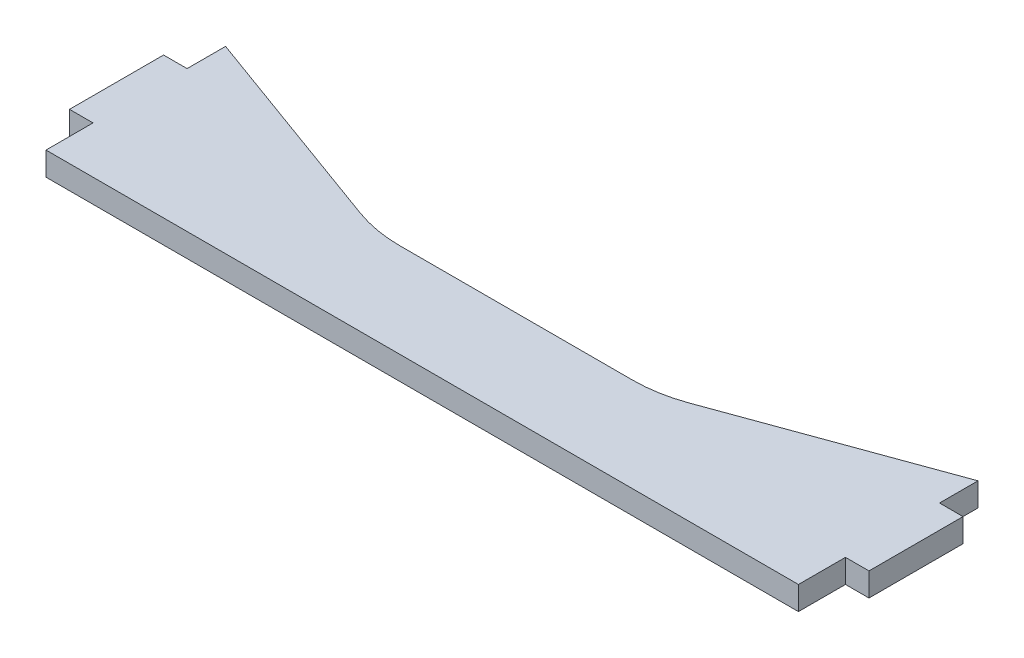
ISO-10303-21;
HEADER;
FILE_DESCRIPTION(('STEP AP214'),'2;1');
FILE_NAME('part.step','',(''),(''),'','','');
FILE_SCHEMA(('AUTOMOTIVE_DESIGN { 1 0 10303 214 1 1 1 1 }'));
ENDSEC;
DATA;
#1=APPLICATION_CONTEXT('core data for automotive mechanical design processes');
#2=APPLICATION_PROTOCOL_DEFINITION('international standard','automotive_design',2000,#1);
#3=PRODUCT_CONTEXT('',#1,'mechanical');
#4=PRODUCT('Part','Part','',(#3));
#5=PRODUCT_RELATED_PRODUCT_CATEGORY('part','',(#4));
#6=PRODUCT_DEFINITION_FORMATION('','',#4);
#7=PRODUCT_DEFINITION_CONTEXT('part definition',#1,'design');
#8=PRODUCT_DEFINITION('design','',#6,#7);
#9=PRODUCT_DEFINITION_SHAPE('','',#8);
#10=(LENGTH_UNIT() NAMED_UNIT(*) SI_UNIT(.MILLI.,.METRE.));
#11=(NAMED_UNIT(*) PLANE_ANGLE_UNIT() SI_UNIT($,.RADIAN.));
#12=(NAMED_UNIT(*) SI_UNIT($,.STERADIAN.) SOLID_ANGLE_UNIT());
#13=UNCERTAINTY_MEASURE_WITH_UNIT(LENGTH_MEASURE(1.E-05),#10,'distance_accuracy_value','');
#14=(GEOMETRIC_REPRESENTATION_CONTEXT(3) GLOBAL_UNCERTAINTY_ASSIGNED_CONTEXT((#13)) GLOBAL_UNIT_ASSIGNED_CONTEXT((#10,
#11,#12)) REPRESENTATION_CONTEXT('',''));
#15=CARTESIAN_POINT('',(0.,0.,0.));
#16=DIRECTION('',(0.,0.,1.));
#17=DIRECTION('',(1.,0.,0.));
#18=AXIS2_PLACEMENT_3D('',#15,#16,#17);
#19=CARTESIAN_POINT('',(0.,5.,0.));
#20=DIRECTION('',(1.,0.,0.));
#21=DIRECTION('',(0.,0.,-1.));
#22=AXIS2_PLACEMENT_3D('',#19,#20,#21);
#23=PLANE('',#22);
#24=DIRECTION('',(0.,0.,1.));
#25=VECTOR('',#24,1.);
#26=CARTESIAN_POINT('',(0.,0.,0.));
#27=LINE('',#26,#25);
#28=CARTESIAN_POINT('',(0.,0.,-30.));
#29=VERTEX_POINT('',#28);
#30=CARTESIAN_POINT('',(0.,0.,-10.));
#31=VERTEX_POINT('',#30);
#32=EDGE_CURVE('E174',#29,#31,#27,.T.);
#33=ORIENTED_EDGE('',*,*,#32,.T.);
#34=DIRECTION('',(0.,-1.,0.));
#35=VECTOR('',#34,1.);
#36=CARTESIAN_POINT('',(0.,10.,-10.));
#37=LINE('',#36,#35);
#38=CARTESIAN_POINT('',(0.,5.,-10.));
#39=VERTEX_POINT('',#38);
#40=EDGE_CURVE('E52',#39,#31,#37,.T.);
#41=ORIENTED_EDGE('',*,*,#40,.F.);
#42=DIRECTION('',(0.,0.,1.));
#43=VECTOR('',#42,1.);
#44=CARTESIAN_POINT('',(0.,5.,0.));
#45=LINE('',#44,#43);
#46=CARTESIAN_POINT('',(0.,5.,-30.));
#47=VERTEX_POINT('',#46);
#48=EDGE_CURVE('E192',#47,#39,#45,.T.);
#49=ORIENTED_EDGE('',*,*,#48,.F.);
#50=DIRECTION('',(0.,-1.,0.));
#51=VECTOR('',#50,1.);
#52=CARTESIAN_POINT('',(0.,10.,-30.));
#53=LINE('',#52,#51);
#54=EDGE_CURVE('E287',#47,#29,#53,.T.);
#55=ORIENTED_EDGE('',*,*,#54,.T.);
#56=EDGE_LOOP('',(#33,#41,#49,#55));
#57=FACE_BOUND('',#56,.T.);
#58=ADVANCED_FACE('F37',(#57),#23,.F.);
#59=CARTESIAN_POINT('',(0.,5.,0.));
#60=DIRECTION('',(0.,0.,-1.));
#61=DIRECTION('',(-1.,0.,0.));
#62=AXIS2_PLACEMENT_3D('',#59,#60,#61);
#63=PLANE('',#62);
#64=DIRECTION('',(1.,0.,0.));
#65=VECTOR('',#64,1.);
#66=CARTESIAN_POINT('',(0.,5.,0.));
#67=LINE('',#66,#65);
#68=CARTESIAN_POINT('',(4.99999999999999,5.,0.));
#69=VERTEX_POINT('',#68);
#70=CARTESIAN_POINT('',(165.,5.,0.));
#71=VERTEX_POINT('',#70);
#72=EDGE_CURVE('E167',#69,#71,#67,.T.);
#73=ORIENTED_EDGE('',*,*,#72,.F.);
#74=DIRECTION('',(0.,-1.,0.));
#75=VECTOR('',#74,1.);
#76=CARTESIAN_POINT('',(4.99999999999999,10.,0.));
#77=LINE('',#76,#75);
#78=CARTESIAN_POINT('',(4.99999999999999,0.,0.));
#79=VERTEX_POINT('',#78);
#80=EDGE_CURVE('E153',#69,#79,#77,.T.);
#81=ORIENTED_EDGE('',*,*,#80,.T.);
#82=DIRECTION('',(1.,0.,0.));
#83=VECTOR('',#82,1.);
#84=CARTESIAN_POINT('',(0.,0.,0.));
#85=LINE('',#84,#83);
#86=CARTESIAN_POINT('',(165.,0.,0.));
#87=VERTEX_POINT('',#86);
#88=EDGE_CURVE('E165',#79,#87,#85,.T.);
#89=ORIENTED_EDGE('',*,*,#88,.T.);
#90=DIRECTION('',(0.,-1.,0.));
#91=VECTOR('',#90,1.);
#92=CARTESIAN_POINT('',(165.,10.,0.));
#93=LINE('',#92,#91);
#94=EDGE_CURVE('E307',#71,#87,#93,.T.);
#95=ORIENTED_EDGE('',*,*,#94,.F.);
#96=EDGE_LOOP('',(#73,#81,#89,#95));
#97=FACE_BOUND('',#96,.T.);
#98=ADVANCED_FACE('F163',(#97),#63,.F.);
#99=CARTESIAN_POINT('',(170.,5.,0.));
#100=DIRECTION('',(-1.,0.,0.));
#101=DIRECTION('',(0.,0.,1.));
#102=AXIS2_PLACEMENT_3D('',#99,#100,#101);
#103=PLANE('',#102);
#104=DIRECTION('',(0.,0.,-1.));
#105=VECTOR('',#104,1.);
#106=CARTESIAN_POINT('',(170.,0.,0.));
#107=LINE('',#106,#105);
#108=CARTESIAN_POINT('',(170.,0.,-9.99999999999999));
#109=VERTEX_POINT('',#108);
#110=CARTESIAN_POINT('',(170.,0.,-30.));
#111=VERTEX_POINT('',#110);
#112=EDGE_CURVE('E173',#109,#111,#107,.T.);
#113=ORIENTED_EDGE('',*,*,#112,.T.);
#114=DIRECTION('',(0.,-1.,0.));
#115=VECTOR('',#114,1.);
#116=CARTESIAN_POINT('',(170.,10.,-30.));
#117=LINE('',#116,#115);
#118=CARTESIAN_POINT('',(170.,5.,-30.));
#119=VERTEX_POINT('',#118);
#120=EDGE_CURVE('E299',#119,#111,#117,.T.);
#121=ORIENTED_EDGE('',*,*,#120,.F.);
#122=DIRECTION('',(0.,0.,-1.));
#123=VECTOR('',#122,1.);
#124=CARTESIAN_POINT('',(170.,5.,0.));
#125=LINE('',#124,#123);
#126=CARTESIAN_POINT('',(170.,5.,-9.99999999999999));
#127=VERTEX_POINT('',#126);
#128=EDGE_CURVE('E252',#127,#119,#125,.T.);
#129=ORIENTED_EDGE('',*,*,#128,.F.);
#130=DIRECTION('',(0.,-1.,0.));
#131=VECTOR('',#130,1.);
#132=CARTESIAN_POINT('',(170.,10.,-9.99999999999999));
#133=LINE('',#132,#131);
#134=EDGE_CURVE('E309',#127,#109,#133,.T.);
#135=ORIENTED_EDGE('',*,*,#134,.T.);
#136=EDGE_LOOP('',(#113,#121,#129,#135));
#137=FACE_BOUND('',#136,.T.);
#138=ADVANCED_FACE('F319',(#137),#103,.F.);
#139=CARTESIAN_POINT('',(0.,5.,-20.));
#140=DIRECTION('',(0.,0.,1.));
#141=DIRECTION('',(1.,0.,0.));
#142=AXIS2_PLACEMENT_3D('',#139,#140,#141);
#143=PLANE('',#142);
#144=DIRECTION('',(-1.,0.,0.));
#145=VECTOR('',#144,1.);
#146=CARTESIAN_POINT('',(0.,0.,-20.));
#147=LINE('',#146,#145);
#148=CARTESIAN_POINT('',(109.714750669603,0.,-20.));
#149=VERTEX_POINT('',#148);
#150=CARTESIAN_POINT('',(60.2852493303972,0.,-20.));
#151=VERTEX_POINT('',#150);
#152=EDGE_CURVE('E177',#149,#151,#147,.T.);
#153=ORIENTED_EDGE('',*,*,#152,.T.);
#154=DIRECTION('',(0.,1.,0.));
#155=VECTOR('',#154,1.);
#156=CARTESIAN_POINT('',(60.2852493303972,5.,-20.));
#157=LINE('',#156,#155);
#158=CARTESIAN_POINT('',(60.2852493303972,5.,-20.));
#159=VERTEX_POINT('',#158);
#160=EDGE_CURVE('E196',#151,#159,#157,.T.);
#161=ORIENTED_EDGE('',*,*,#160,.T.);
#162=DIRECTION('',(-1.,0.,0.));
#163=VECTOR('',#162,1.);
#164=CARTESIAN_POINT('',(0.,5.,-20.));
#165=LINE('',#164,#163);
#166=CARTESIAN_POINT('',(109.714750669603,5.,-20.));
#167=VERTEX_POINT('',#166);
#168=EDGE_CURVE('E193',#167,#159,#165,.T.);
#169=ORIENTED_EDGE('',*,*,#168,.F.);
#170=DIRECTION('',(0.,1.,0.));
#171=VECTOR('',#170,1.);
#172=CARTESIAN_POINT('',(109.714750669603,5.,-20.));
#173=LINE('',#172,#171);
#174=EDGE_CURVE('E194',#167,#149,#173,.F.);
#175=ORIENTED_EDGE('',*,*,#174,.T.);
#176=EDGE_LOOP('',(#153,#161,#169,#175));
#177=FACE_BOUND('',#176,.T.);
#178=ADVANCED_FACE('F261',(#177),#143,.F.);
#179=CARTESIAN_POINT('',(0.,5.,0.));
#180=DIRECTION('',(0.,-1.,0.));
#181=DIRECTION('',(0.,0.,-1.));
#182=AXIS2_PLACEMENT_3D('',#179,#180,#181);
#183=PLANE('',#182);
#184=DIRECTION('',(1.,0.,0.));
#185=VECTOR('',#184,1.);
#186=CARTESIAN_POINT('',(0.,5.,-10.));
#187=LINE('',#186,#185);
#188=CARTESIAN_POINT('',(4.99999999999999,5.,-10.));
#189=VERTEX_POINT('',#188);
#190=EDGE_CURVE('E283',#39,#189,#187,.T.);
#191=ORIENTED_EDGE('',*,*,#190,.T.);
#192=DIRECTION('',(0.,0.,1.));
#193=VECTOR('',#192,1.);
#194=CARTESIAN_POINT('',(4.99999999999999,5.,0.));
#195=LINE('',#194,#193);
#196=EDGE_CURVE('E279',#189,#69,#195,.T.);
#197=ORIENTED_EDGE('',*,*,#196,.T.);
#198=ORIENTED_EDGE('',*,*,#72,.T.);
#199=DIRECTION('',(0.,0.,-1.));
#200=VECTOR('',#199,1.);
#201=CARTESIAN_POINT('',(165.,5.,0.));
#202=LINE('',#201,#200);
#203=CARTESIAN_POINT('',(165.,5.,-9.99999999999999));
#204=VERTEX_POINT('',#203);
#205=EDGE_CURVE('E242',#71,#204,#202,.T.);
#206=ORIENTED_EDGE('',*,*,#205,.T.);
#207=DIRECTION('',(1.,0.,0.));
#208=VECTOR('',#207,1.);
#209=CARTESIAN_POINT('',(0.,5.,-9.99999999999999));
#210=LINE('',#209,#208);
#211=EDGE_CURVE('E246',#204,#127,#210,.T.);
#212=ORIENTED_EDGE('',*,*,#211,.T.);
#213=ORIENTED_EDGE('',*,*,#128,.T.);
#214=DIRECTION('',(-1.,0.,0.));
#215=VECTOR('',#214,1.);
#216=CARTESIAN_POINT('',(0.,5.,-30.));
#217=LINE('',#216,#215);
#218=CARTESIAN_POINT('',(165.,5.,-30.));
#219=VERTEX_POINT('',#218);
#220=EDGE_CURVE('E237',#119,#219,#217,.T.);
#221=ORIENTED_EDGE('',*,*,#220,.T.);
#222=DIRECTION('',(0.,0.,-1.));
#223=VECTOR('',#222,1.);
#224=CARTESIAN_POINT('',(165.,5.,0.));
#225=LINE('',#224,#223);
#226=CARTESIAN_POINT('',(165.,5.,-38.1818181818182));
#227=VERTEX_POINT('',#226);
#228=EDGE_CURVE('E223',#219,#227,#225,.T.);
#229=ORIENTED_EDGE('',*,*,#228,.T.);
#230=DIRECTION('',(-0.939793423488437,0.,0.341743063086704));
#231=VECTOR('',#230,1.);
#232=CARTESIAN_POINT('',(7.007299270073,5.,19.2700729927007));
#233=LINE('',#232,#231);
#234=CARTESIAN_POINT('',(119.967042562204,5.,-21.8061972953469));
#235=VERTEX_POINT('',#234);
#236=EDGE_CURVE('E234',#227,#235,#233,.T.);
#237=ORIENTED_EDGE('',*,*,#236,.T.);
#238=CARTESIAN_POINT('',(109.714750669603,5.,-50.));
#239=DIRECTION('',(0.,-1.,0.));
#240=DIRECTION('',(0.,0.,-1.));
#241=AXIS2_PLACEMENT_3D('',#238,#239,#240);
#242=CIRCLE('',#241,30.);
#243=EDGE_CURVE('E215',#235,#167,#242,.T.);
#244=ORIENTED_EDGE('',*,*,#243,.T.);
#245=ORIENTED_EDGE('',*,*,#168,.T.);
#246=CARTESIAN_POINT('',(60.2852493303972,5.,-50.));
#247=DIRECTION('',(0.,-1.,0.));
#248=DIRECTION('',(0.,0.,-1.));
#249=AXIS2_PLACEMENT_3D('',#246,#247,#248);
#250=CIRCLE('',#249,30.);
#251=CARTESIAN_POINT('',(50.032957437796,5.,-21.8061972953469));
#252=VERTEX_POINT('',#251);
#253=EDGE_CURVE('E211',#159,#252,#250,.T.);
#254=ORIENTED_EDGE('',*,*,#253,.T.);
#255=DIRECTION('',(-0.939793423488437,0.,-0.341743063086704));
#256=VECTOR('',#255,1.);
#257=CARTESIAN_POINT('',(12.8467153284672,5.,-35.3284671532847));
#258=LINE('',#257,#256);
#259=CARTESIAN_POINT('',(4.99999999999999,5.,-38.1818181818182));
#260=VERTEX_POINT('',#259);
#261=EDGE_CURVE('E200',#252,#260,#258,.T.);
#262=ORIENTED_EDGE('',*,*,#261,.T.);
#263=DIRECTION('',(0.,0.,1.));
#264=VECTOR('',#263,1.);
#265=CARTESIAN_POINT('',(4.99999999999999,5.,0.));
#266=LINE('',#265,#264);
#267=CARTESIAN_POINT('',(4.99999999999999,5.,-30.));
#268=VERTEX_POINT('',#267);
#269=EDGE_CURVE('E59',#260,#268,#266,.T.);
#270=ORIENTED_EDGE('',*,*,#269,.T.);
#271=DIRECTION('',(-1.,0.,0.));
#272=VECTOR('',#271,1.);
#273=CARTESIAN_POINT('',(0.,5.,-30.));
#274=LINE('',#273,#272);
#275=EDGE_CURVE('E292',#268,#47,#274,.T.);
#276=ORIENTED_EDGE('',*,*,#275,.T.);
#277=ORIENTED_EDGE('',*,*,#48,.T.);
#278=EDGE_LOOP('',(#191,#197,#198,#206,#212,#213,#221,#229,#237,#244,#245,#254,#262,#270,#276,#277));
#279=FACE_BOUND('',#278,.T.);
#280=ADVANCED_FACE('F233',(#279),#183,.F.);
#281=CARTESIAN_POINT('',(0.,0.,0.));
#282=DIRECTION('',(0.,-1.,0.));
#283=DIRECTION('',(0.,0.,-1.));
#284=AXIS2_PLACEMENT_3D('',#281,#282,#283);
#285=PLANE('',#284);
#286=DIRECTION('',(0.,0.,1.));
#287=VECTOR('',#286,1.);
#288=CARTESIAN_POINT('',(4.99999999999999,0.,-10.));
#289=LINE('',#288,#287);
#290=CARTESIAN_POINT('',(4.99999999999999,0.,-10.));
#291=VERTEX_POINT('',#290);
#292=EDGE_CURVE('E150',#291,#79,#289,.T.);
#293=ORIENTED_EDGE('',*,*,#292,.F.);
#294=DIRECTION('',(1.,0.,0.));
#295=VECTOR('',#294,1.);
#296=CARTESIAN_POINT('',(4.99999999999999,0.,-10.));
#297=LINE('',#296,#295);
#298=EDGE_CURVE('E159',#31,#291,#297,.T.);
#299=ORIENTED_EDGE('',*,*,#298,.F.);
#300=ORIENTED_EDGE('',*,*,#32,.F.);
#301=DIRECTION('',(-1.,0.,0.));
#302=VECTOR('',#301,1.);
#303=CARTESIAN_POINT('',(4.99999999999999,0.,-30.));
#304=LINE('',#303,#302);
#305=CARTESIAN_POINT('',(4.99999999999999,0.,-30.));
#306=VERTEX_POINT('',#305);
#307=EDGE_CURVE('E278',#306,#29,#304,.T.);
#308=ORIENTED_EDGE('',*,*,#307,.F.);
#309=DIRECTION('',(0.,0.,1.));
#310=VECTOR('',#309,1.);
#311=CARTESIAN_POINT('',(4.99999999999999,0.,-30.));
#312=LINE('',#311,#310);
#313=CARTESIAN_POINT('',(4.99999999999999,0.,-38.1818181818182));
#314=VERTEX_POINT('',#313);
#315=EDGE_CURVE('E276',#314,#306,#312,.T.);
#316=ORIENTED_EDGE('',*,*,#315,.F.);
#317=DIRECTION('',(-0.939793423488437,0.,-0.341743063086704));
#318=VECTOR('',#317,1.);
#319=CARTESIAN_POINT('',(12.8467153284672,0.,-35.3284671532847));
#320=LINE('',#319,#318);
#321=CARTESIAN_POINT('',(50.032957437796,0.,-21.8061972953469));
#322=VERTEX_POINT('',#321);
#323=EDGE_CURVE('E180',#322,#314,#320,.T.);
#324=ORIENTED_EDGE('',*,*,#323,.F.);
#325=CARTESIAN_POINT('',(60.2852493303972,0.,-50.));
#326=DIRECTION('',(0.,-1.,0.));
#327=DIRECTION('',(0.,0.,-1.));
#328=AXIS2_PLACEMENT_3D('',#325,#326,#327);
#329=CIRCLE('',#328,30.);
#330=EDGE_CURVE('E213',#322,#151,#329,.F.);
#331=ORIENTED_EDGE('',*,*,#330,.T.);
#332=ORIENTED_EDGE('',*,*,#152,.F.);
#333=CARTESIAN_POINT('',(109.714750669603,0.,-50.));
#334=DIRECTION('',(0.,-1.,0.));
#335=DIRECTION('',(0.,0.,-1.));
#336=AXIS2_PLACEMENT_3D('',#333,#334,#335);
#337=CIRCLE('',#336,30.);
#338=CARTESIAN_POINT('',(119.967042562204,0.,-21.8061972953469));
#339=VERTEX_POINT('',#338);
#340=EDGE_CURVE('E217',#149,#339,#337,.F.);
#341=ORIENTED_EDGE('',*,*,#340,.T.);
#342=DIRECTION('',(-0.939793423488437,0.,0.341743063086704));
#343=VECTOR('',#342,1.);
#344=CARTESIAN_POINT('',(7.007299270073,0.,19.2700729927007));
#345=LINE('',#344,#343);
#346=CARTESIAN_POINT('',(165.,0.,-38.1818181818182));
#347=VERTEX_POINT('',#346);
#348=EDGE_CURVE('E203',#347,#339,#345,.T.);
#349=ORIENTED_EDGE('',*,*,#348,.F.);
#350=DIRECTION('',(0.,0.,-1.));
#351=VECTOR('',#350,1.);
#352=CARTESIAN_POINT('',(165.,0.,-30.));
#353=LINE('',#352,#351);
#354=CARTESIAN_POINT('',(165.,0.,-30.));
#355=VERTEX_POINT('',#354);
#356=EDGE_CURVE('E226',#355,#347,#353,.T.);
#357=ORIENTED_EDGE('',*,*,#356,.F.);
#358=DIRECTION('',(-1.,0.,0.));
#359=VECTOR('',#358,1.);
#360=CARTESIAN_POINT('',(165.,0.,-30.));
#361=LINE('',#360,#359);
#362=EDGE_CURVE('E296',#111,#355,#361,.T.);
#363=ORIENTED_EDGE('',*,*,#362,.F.);
#364=ORIENTED_EDGE('',*,*,#112,.F.);
#365=DIRECTION('',(1.,0.,0.));
#366=VECTOR('',#365,1.);
#367=CARTESIAN_POINT('',(165.,0.,-9.99999999999999));
#368=LINE('',#367,#366);
#369=CARTESIAN_POINT('',(165.,0.,-9.99999999999999));
#370=VERTEX_POINT('',#369);
#371=EDGE_CURVE('E304',#370,#109,#368,.T.);
#372=ORIENTED_EDGE('',*,*,#371,.F.);
#373=DIRECTION('',(0.,0.,-1.));
#374=VECTOR('',#373,1.);
#375=CARTESIAN_POINT('',(165.,0.,-9.99999999999999));
#376=LINE('',#375,#374);
#377=EDGE_CURVE('E172',#87,#370,#376,.T.);
#378=ORIENTED_EDGE('',*,*,#377,.F.);
#379=ORIENTED_EDGE('',*,*,#88,.F.);
#380=EDGE_LOOP('',(#293,#299,#300,#308,#316,#324,#331,#332,#341,#349,#357,#363,#364,#372,#378,#379));
#381=FACE_BOUND('',#380,.T.);
#382=ADVANCED_FACE('F170',(#381),#285,.T.);
#383=CARTESIAN_POINT('',(12.8467153284672,0.,-35.3284671532847));
#384=DIRECTION('',(0.341743063086704,0.,-0.939793423488437));
#385=DIRECTION('',(-0.939793423488437,0.,-0.341743063086704));
#386=AXIS2_PLACEMENT_3D('',#383,#384,#385);
#387=PLANE('',#386);
#388=DIRECTION('',(0.,-1.,0.));
#389=VECTOR('',#388,1.);
#390=CARTESIAN_POINT('',(4.99999999999999,0.,-38.1818181818182));
#391=LINE('',#390,#389);
#392=EDGE_CURVE('E12',#260,#314,#391,.T.);
#393=ORIENTED_EDGE('',*,*,#392,.F.);
#394=ORIENTED_EDGE('',*,*,#261,.F.);
#395=DIRECTION('',(0.,1.,0.));
#396=VECTOR('',#395,1.);
#397=CARTESIAN_POINT('',(50.032957437796,0.,-21.8061972953469));
#398=LINE('',#397,#396);
#399=EDGE_CURVE('E199',#252,#322,#398,.F.);
#400=ORIENTED_EDGE('',*,*,#399,.T.);
#401=ORIENTED_EDGE('',*,*,#323,.T.);
#402=EDGE_LOOP('',(#393,#394,#400,#401));
#403=FACE_BOUND('',#402,.T.);
#404=ADVANCED_FACE('F272',(#403),#387,.T.);
#405=CARTESIAN_POINT('',(7.007299270073,0.,19.2700729927007));
#406=DIRECTION('',(-0.341743063086704,0.,-0.939793423488437));
#407=DIRECTION('',(-0.939793423488437,0.,0.341743063086704));
#408=AXIS2_PLACEMENT_3D('',#405,#406,#407);
#409=PLANE('',#408);
#410=DIRECTION('',(0.,1.,0.));
#411=VECTOR('',#410,1.);
#412=CARTESIAN_POINT('',(165.,0.,-38.1818181818182));
#413=LINE('',#412,#411);
#414=EDGE_CURVE('E45',#347,#227,#413,.T.);
#415=ORIENTED_EDGE('',*,*,#414,.F.);
#416=ORIENTED_EDGE('',*,*,#348,.T.);
#417=DIRECTION('',(0.,1.,0.));
#418=VECTOR('',#417,1.);
#419=CARTESIAN_POINT('',(119.967042562204,0.,-21.8061972953469));
#420=LINE('',#419,#418);
#421=EDGE_CURVE('E208',#339,#235,#420,.T.);
#422=ORIENTED_EDGE('',*,*,#421,.T.);
#423=ORIENTED_EDGE('',*,*,#236,.F.);
#424=EDGE_LOOP('',(#415,#416,#422,#423));
#425=FACE_BOUND('',#424,.T.);
#426=ADVANCED_FACE('F240',(#425),#409,.T.);
#427=CARTESIAN_POINT('',(60.2852493303972,5.,-50.));
#428=DIRECTION('',(0.,1.,0.));
#429=DIRECTION('',(0.,0.,1.));
#430=AXIS2_PLACEMENT_3D('',#427,#428,#429);
#431=CYLINDRICAL_SURFACE('',#430,30.);
#432=ORIENTED_EDGE('',*,*,#330,.F.);
#433=ORIENTED_EDGE('',*,*,#399,.F.);
#434=ORIENTED_EDGE('',*,*,#253,.F.);
#435=ORIENTED_EDGE('',*,*,#160,.F.);
#436=EDGE_LOOP('',(#432,#433,#434,#435));
#437=FACE_BOUND('',#436,.T.);
#438=ADVANCED_FACE('F269',(#437),#431,.F.);
#439=CARTESIAN_POINT('',(109.714750669603,0.,-50.));
#440=DIRECTION('',(0.,1.,0.));
#441=DIRECTION('',(0.,0.,1.));
#442=AXIS2_PLACEMENT_3D('',#439,#440,#441);
#443=CYLINDRICAL_SURFACE('',#442,30.);
#444=ORIENTED_EDGE('',*,*,#340,.F.);
#445=ORIENTED_EDGE('',*,*,#174,.F.);
#446=ORIENTED_EDGE('',*,*,#243,.F.);
#447=ORIENTED_EDGE('',*,*,#421,.F.);
#448=EDGE_LOOP('',(#444,#445,#446,#447));
#449=FACE_BOUND('',#448,.T.);
#450=ADVANCED_FACE('F39',(#449),#443,.F.);
#451=CARTESIAN_POINT('',(165.,10.,-9.99999999999999));
#452=DIRECTION('',(-1.,0.,0.));
#453=DIRECTION('',(0.,0.,1.));
#454=AXIS2_PLACEMENT_3D('',#451,#452,#453);
#455=PLANE('',#454);
#456=ORIENTED_EDGE('',*,*,#94,.T.);
#457=ORIENTED_EDGE('',*,*,#377,.T.);
#458=DIRECTION('',(0.,-1.,0.));
#459=VECTOR('',#458,1.);
#460=CARTESIAN_POINT('',(165.,10.,-9.99999999999999));
#461=LINE('',#460,#459);
#462=EDGE_CURVE('E306',#204,#370,#461,.T.);
#463=ORIENTED_EDGE('',*,*,#462,.F.);
#464=ORIENTED_EDGE('',*,*,#205,.F.);
#465=EDGE_LOOP('',(#456,#457,#463,#464));
#466=FACE_BOUND('',#465,.T.);
#467=ADVANCED_FACE('F326',(#466),#455,.F.);
#468=CARTESIAN_POINT('',(165.,10.,-9.99999999999999));
#469=DIRECTION('',(0.,0.,-1.));
#470=DIRECTION('',(-1.,0.,0.));
#471=AXIS2_PLACEMENT_3D('',#468,#469,#470);
#472=PLANE('',#471);
#473=ORIENTED_EDGE('',*,*,#462,.T.);
#474=ORIENTED_EDGE('',*,*,#371,.T.);
#475=ORIENTED_EDGE('',*,*,#134,.F.);
#476=ORIENTED_EDGE('',*,*,#211,.F.);
#477=EDGE_LOOP('',(#473,#474,#475,#476));
#478=FACE_BOUND('',#477,.T.);
#479=ADVANCED_FACE('F324',(#478),#472,.F.);
#480=CARTESIAN_POINT('',(165.,10.,-30.));
#481=DIRECTION('',(0.,0.,1.));
#482=DIRECTION('',(1.,0.,0.));
#483=AXIS2_PLACEMENT_3D('',#480,#481,#482);
#484=PLANE('',#483);
#485=ORIENTED_EDGE('',*,*,#120,.T.);
#486=ORIENTED_EDGE('',*,*,#362,.T.);
#487=DIRECTION('',(0.,-1.,0.));
#488=VECTOR('',#487,1.);
#489=CARTESIAN_POINT('',(165.,10.,-30.));
#490=LINE('',#489,#488);
#491=EDGE_CURVE('E238',#219,#355,#490,.T.);
#492=ORIENTED_EDGE('',*,*,#491,.F.);
#493=ORIENTED_EDGE('',*,*,#220,.F.);
#494=EDGE_LOOP('',(#485,#486,#492,#493));
#495=FACE_BOUND('',#494,.T.);
#496=ADVANCED_FACE('F323',(#495),#484,.F.);
#497=CARTESIAN_POINT('',(165.,10.,-30.));
#498=DIRECTION('',(-1.,0.,0.));
#499=DIRECTION('',(0.,0.,1.));
#500=AXIS2_PLACEMENT_3D('',#497,#498,#499);
#501=PLANE('',#500);
#502=ORIENTED_EDGE('',*,*,#491,.T.);
#503=ORIENTED_EDGE('',*,*,#356,.T.);
#504=ORIENTED_EDGE('',*,*,#414,.T.);
#505=ORIENTED_EDGE('',*,*,#228,.F.);
#506=EDGE_LOOP('',(#502,#503,#504,#505));
#507=FACE_BOUND('',#506,.T.);
#508=ADVANCED_FACE('F222',(#507),#501,.F.);
#509=CARTESIAN_POINT('',(4.99999999999999,10.,-30.));
#510=DIRECTION('',(0.,0.,1.));
#511=DIRECTION('',(1.,0.,0.));
#512=AXIS2_PLACEMENT_3D('',#509,#510,#511);
#513=PLANE('',#512);
#514=DIRECTION('',(0.,-1.,0.));
#515=VECTOR('',#514,1.);
#516=CARTESIAN_POINT('',(4.99999999999999,10.,-30.));
#517=LINE('',#516,#515);
#518=EDGE_CURVE('E281',#268,#306,#517,.T.);
#519=ORIENTED_EDGE('',*,*,#518,.T.);
#520=ORIENTED_EDGE('',*,*,#307,.T.);
#521=ORIENTED_EDGE('',*,*,#54,.F.);
#522=ORIENTED_EDGE('',*,*,#275,.F.);
#523=EDGE_LOOP('',(#519,#520,#521,#522));
#524=FACE_BOUND('',#523,.T.);
#525=ADVANCED_FACE('F413',(#524),#513,.F.);
#526=CARTESIAN_POINT('',(4.99999999999999,10.,-30.));
#527=DIRECTION('',(1.,0.,0.));
#528=DIRECTION('',(0.,0.,-1.));
#529=AXIS2_PLACEMENT_3D('',#526,#527,#528);
#530=PLANE('',#529);
#531=ORIENTED_EDGE('',*,*,#392,.T.);
#532=ORIENTED_EDGE('',*,*,#315,.T.);
#533=ORIENTED_EDGE('',*,*,#518,.F.);
#534=ORIENTED_EDGE('',*,*,#269,.F.);
#535=EDGE_LOOP('',(#531,#532,#533,#534));
#536=FACE_BOUND('',#535,.T.);
#537=ADVANCED_FACE('F421',(#536),#530,.F.);
#538=CARTESIAN_POINT('',(4.99999999999999,10.,-10.));
#539=DIRECTION('',(1.,0.,0.));
#540=DIRECTION('',(0.,0.,-1.));
#541=AXIS2_PLACEMENT_3D('',#538,#539,#540);
#542=PLANE('',#541);
#543=DIRECTION('',(0.,-1.,0.));
#544=VECTOR('',#543,1.);
#545=CARTESIAN_POINT('',(4.99999999999999,10.,-10.));
#546=LINE('',#545,#544);
#547=EDGE_CURVE('E156',#189,#291,#546,.T.);
#548=ORIENTED_EDGE('',*,*,#547,.T.);
#549=ORIENTED_EDGE('',*,*,#292,.T.);
#550=ORIENTED_EDGE('',*,*,#80,.F.);
#551=ORIENTED_EDGE('',*,*,#196,.F.);
#552=EDGE_LOOP('',(#548,#549,#550,#551));
#553=FACE_BOUND('',#552,.T.);
#554=ADVANCED_FACE('F152',(#553),#542,.F.);
#555=CARTESIAN_POINT('',(4.99999999999999,10.,-10.));
#556=DIRECTION('',(0.,0.,-1.));
#557=DIRECTION('',(-1.,0.,0.));
#558=AXIS2_PLACEMENT_3D('',#555,#556,#557);
#559=PLANE('',#558);
#560=ORIENTED_EDGE('',*,*,#40,.T.);
#561=ORIENTED_EDGE('',*,*,#298,.T.);
#562=ORIENTED_EDGE('',*,*,#547,.F.);
#563=ORIENTED_EDGE('',*,*,#190,.F.);
#564=EDGE_LOOP('',(#560,#561,#562,#563));
#565=FACE_BOUND('',#564,.T.);
#566=ADVANCED_FACE('F437',(#565),#559,.F.);
#567=CLOSED_SHELL('',(#58,#98,#138,#178,#280,#382,#404,#426,#438,#450,#467,#479,#496,#508,#525,
#537,#554,#566));
#568=MANIFOLD_SOLID_BREP('B2',#567);
#569=ADVANCED_BREP_SHAPE_REPRESENTATION('',(#18,#568),#14);
#570=SHAPE_DEFINITION_REPRESENTATION(#9,#569);
ENDSEC;
END-ISO-10303-21;
